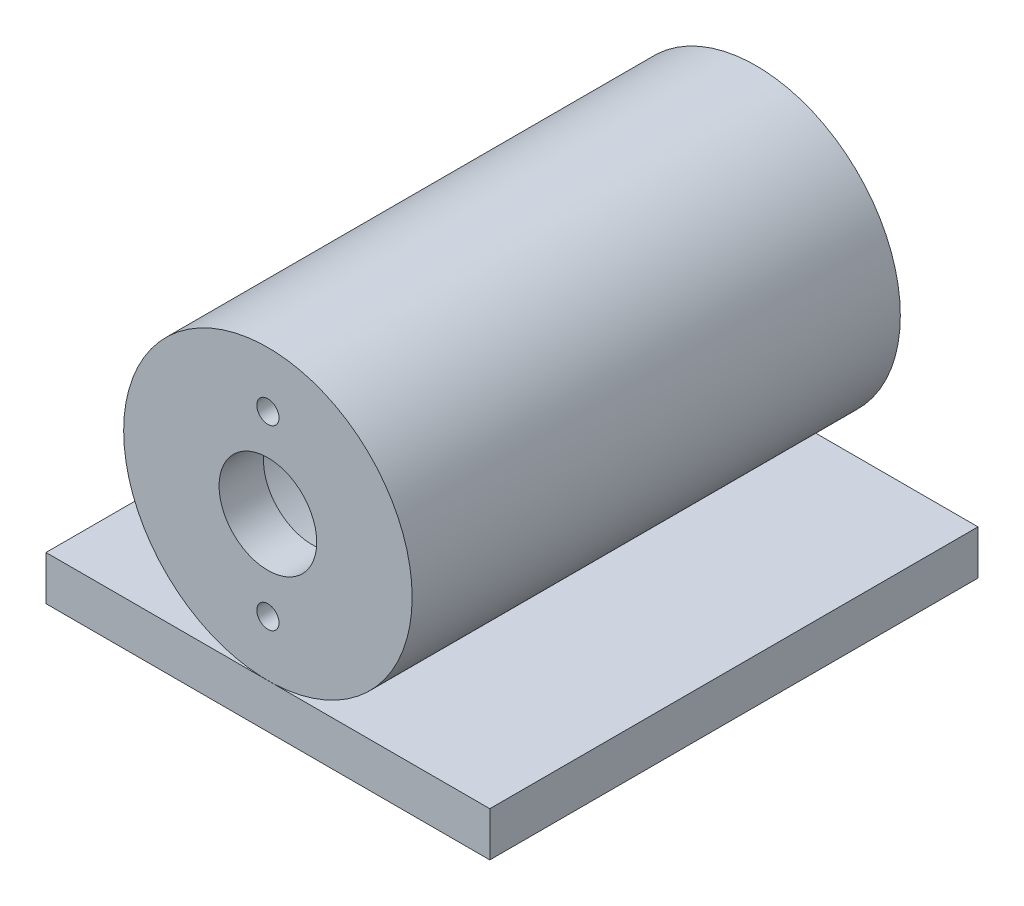
ISO-10303-21;
HEADER;
FILE_DESCRIPTION(('STEP AP214'),'2;1');
FILE_NAME('part.step','',(''),(''),'','','');
FILE_SCHEMA(('AUTOMOTIVE_DESIGN { 1 0 10303 214 1 1 1 1 }'));
ENDSEC;
DATA;
#1=APPLICATION_CONTEXT('core data for automotive mechanical design processes');
#2=APPLICATION_PROTOCOL_DEFINITION('international standard','automotive_design',2000,#1);
#3=PRODUCT_CONTEXT('',#1,'mechanical');
#4=PRODUCT('Part','Part','',(#3));
#5=PRODUCT_RELATED_PRODUCT_CATEGORY('part','',(#4));
#6=PRODUCT_DEFINITION_FORMATION('','',#4);
#7=PRODUCT_DEFINITION_CONTEXT('part definition',#1,'design');
#8=PRODUCT_DEFINITION('design','',#6,#7);
#9=PRODUCT_DEFINITION_SHAPE('','',#8);
#10=(LENGTH_UNIT() NAMED_UNIT(*) SI_UNIT(.MILLI.,.METRE.));
#11=(NAMED_UNIT(*) PLANE_ANGLE_UNIT() SI_UNIT($,.RADIAN.));
#12=(NAMED_UNIT(*) SI_UNIT($,.STERADIAN.) SOLID_ANGLE_UNIT());
#13=UNCERTAINTY_MEASURE_WITH_UNIT(LENGTH_MEASURE(1.E-05),#10,'distance_accuracy_value','');
#14=(GEOMETRIC_REPRESENTATION_CONTEXT(3) GLOBAL_UNCERTAINTY_ASSIGNED_CONTEXT((#13)) GLOBAL_UNIT_ASSIGNED_CONTEXT((#10,
#11,#12)) REPRESENTATION_CONTEXT('',''));
#15=CARTESIAN_POINT('',(0.,0.,0.));
#16=DIRECTION('',(0.,0.,1.));
#17=DIRECTION('',(1.,0.,0.));
#18=AXIS2_PLACEMENT_3D('',#15,#16,#17);
#19=CARTESIAN_POINT('',(0.,-26.9875,0.));
#20=DIRECTION('',(0.,1.,0.));
#21=DIRECTION('',(0.,0.,1.));
#22=AXIS2_PLACEMENT_3D('',#19,#20,#21);
#23=PLANE('',#22);
#24=DIRECTION('',(0.,0.,-1.));
#25=VECTOR('',#24,1.);
#26=CARTESIAN_POINT('',(-31.75,-26.9875,6.35));
#27=LINE('',#26,#25);
#28=CARTESIAN_POINT('',(-31.75,-26.9875,6.35));
#29=VERTEX_POINT('',#28);
#30=CARTESIAN_POINT('',(-31.75,-26.9875,-63.5));
#31=VERTEX_POINT('',#30);
#32=EDGE_CURVE('E55',#29,#31,#27,.T.);
#33=ORIENTED_EDGE('',*,*,#32,.T.);
#34=DIRECTION('',(1.,0.,0.));
#35=VECTOR('',#34,1.);
#36=CARTESIAN_POINT('',(-31.75,-26.9875,-63.5));
#37=LINE('',#36,#35);
#38=CARTESIAN_POINT('',(31.75,-26.9875,-63.5));
#39=VERTEX_POINT('',#38);
#40=EDGE_CURVE('E89',#31,#39,#37,.T.);
#41=ORIENTED_EDGE('',*,*,#40,.T.);
#42=DIRECTION('',(0.,0.,1.));
#43=VECTOR('',#42,1.);
#44=CARTESIAN_POINT('',(31.75,-26.9875,6.35));
#45=LINE('',#44,#43);
#46=CARTESIAN_POINT('',(31.75,-26.9875,6.35));
#47=VERTEX_POINT('',#46);
#48=EDGE_CURVE('E86',#39,#47,#45,.T.);
#49=ORIENTED_EDGE('',*,*,#48,.T.);
#50=DIRECTION('',(-1.,0.,0.));
#51=VECTOR('',#50,1.);
#52=CARTESIAN_POINT('',(-31.75,-26.9875,6.35));
#53=LINE('',#52,#51);
#54=EDGE_CURVE('E83',#47,#29,#53,.T.);
#55=ORIENTED_EDGE('',*,*,#54,.T.);
#56=EDGE_LOOP('',(#33,#41,#49,#55));
#57=FACE_BOUND('',#56,.T.);
#58=ADVANCED_FACE('F46',(#57),#23,.F.);
#59=CARTESIAN_POINT('',(0.,-20.6375,0.));
#60=DIRECTION('',(0.,1.,0.));
#61=DIRECTION('',(0.,0.,1.));
#62=AXIS2_PLACEMENT_3D('',#59,#60,#61);
#63=PLANE('',#62);
#64=DIRECTION('',(0.,0.,-1.));
#65=VECTOR('',#64,1.);
#66=CARTESIAN_POINT('',(-31.75,-20.6375,6.35));
#67=LINE('',#66,#65);
#68=CARTESIAN_POINT('',(-31.75,-20.6375,6.35));
#69=VERTEX_POINT('',#68);
#70=CARTESIAN_POINT('',(-31.75,-20.6375,-63.5));
#71=VERTEX_POINT('',#70);
#72=EDGE_CURVE('E13',#69,#71,#67,.T.);
#73=ORIENTED_EDGE('',*,*,#72,.F.);
#74=DIRECTION('',(-1.,0.,0.));
#75=VECTOR('',#74,1.);
#76=CARTESIAN_POINT('',(-31.75,-20.6375,6.35));
#77=LINE('',#76,#75);
#78=CARTESIAN_POINT('',(31.75,-20.6375,6.35));
#79=VERTEX_POINT('',#78);
#80=EDGE_CURVE('E103',#79,#69,#77,.T.);
#81=ORIENTED_EDGE('',*,*,#80,.F.);
#82=DIRECTION('',(0.,0.,1.));
#83=VECTOR('',#82,1.);
#84=CARTESIAN_POINT('',(31.75,-20.6375,6.35));
#85=LINE('',#84,#83);
#86=CARTESIAN_POINT('',(31.75,-20.6375,-63.5));
#87=VERTEX_POINT('',#86);
#88=EDGE_CURVE('E100',#87,#79,#85,.T.);
#89=ORIENTED_EDGE('',*,*,#88,.F.);
#90=DIRECTION('',(1.,0.,0.));
#91=VECTOR('',#90,1.);
#92=CARTESIAN_POINT('',(-31.75,-20.6375,-63.5));
#93=LINE('',#92,#91);
#94=EDGE_CURVE('E64',#71,#87,#93,.T.);
#95=ORIENTED_EDGE('',*,*,#94,.F.);
#96=EDGE_LOOP('',(#73,#81,#89,#95));
#97=FACE_BOUND('',#96,.T.);
#98=ADVANCED_FACE('F142',(#97),#63,.T.);
#99=CARTESIAN_POINT('',(-31.75,-20.6375,6.35));
#100=DIRECTION('',(0.,0.,1.));
#101=DIRECTION('',(1.,0.,0.));
#102=AXIS2_PLACEMENT_3D('',#99,#100,#101);
#103=PLANE('',#102);
#104=ORIENTED_EDGE('',*,*,#54,.F.);
#105=DIRECTION('',(0.,-1.,0.));
#106=VECTOR('',#105,1.);
#107=CARTESIAN_POINT('',(31.75,-20.6375,6.35));
#108=LINE('',#107,#106);
#109=EDGE_CURVE('E98',#79,#47,#108,.T.);
#110=ORIENTED_EDGE('',*,*,#109,.F.);
#111=ORIENTED_EDGE('',*,*,#80,.T.);
#112=DIRECTION('',(0.,-1.,0.));
#113=VECTOR('',#112,1.);
#114=CARTESIAN_POINT('',(-31.75,-20.6375,6.35));
#115=LINE('',#114,#113);
#116=EDGE_CURVE('E94',#69,#29,#115,.T.);
#117=ORIENTED_EDGE('',*,*,#116,.T.);
#118=EDGE_LOOP('',(#104,#110,#111,#117));
#119=FACE_BOUND('',#118,.T.);
#120=ADVANCED_FACE('F104',(#119),#103,.T.);
#121=CARTESIAN_POINT('',(31.75,-20.6375,6.35));
#122=DIRECTION('',(1.,0.,0.));
#123=DIRECTION('',(0.,0.,-1.));
#124=AXIS2_PLACEMENT_3D('',#121,#122,#123);
#125=PLANE('',#124);
#126=ORIENTED_EDGE('',*,*,#48,.F.);
#127=DIRECTION('',(0.,-1.,0.));
#128=VECTOR('',#127,1.);
#129=CARTESIAN_POINT('',(31.75,-20.6375,-63.5));
#130=LINE('',#129,#128);
#131=EDGE_CURVE('E93',#87,#39,#130,.T.);
#132=ORIENTED_EDGE('',*,*,#131,.F.);
#133=ORIENTED_EDGE('',*,*,#88,.T.);
#134=ORIENTED_EDGE('',*,*,#109,.T.);
#135=EDGE_LOOP('',(#126,#132,#133,#134));
#136=FACE_BOUND('',#135,.T.);
#137=ADVANCED_FACE('F99',(#136),#125,.T.);
#138=CARTESIAN_POINT('',(-31.75,-20.6375,-63.5));
#139=DIRECTION('',(0.,0.,-1.));
#140=DIRECTION('',(-1.,0.,0.));
#141=AXIS2_PLACEMENT_3D('',#138,#139,#140);
#142=PLANE('',#141);
#143=ORIENTED_EDGE('',*,*,#40,.F.);
#144=DIRECTION('',(0.,-1.,0.));
#145=VECTOR('',#144,1.);
#146=CARTESIAN_POINT('',(-31.75,-20.6375,-63.5));
#147=LINE('',#146,#145);
#148=EDGE_CURVE('E118',#71,#31,#147,.T.);
#149=ORIENTED_EDGE('',*,*,#148,.F.);
#150=ORIENTED_EDGE('',*,*,#94,.T.);
#151=ORIENTED_EDGE('',*,*,#131,.T.);
#152=EDGE_LOOP('',(#143,#149,#150,#151));
#153=FACE_BOUND('',#152,.T.);
#154=ADVANCED_FACE('F129',(#153),#142,.T.);
#155=CARTESIAN_POINT('',(-31.75,-20.6375,6.35));
#156=DIRECTION('',(-1.,0.,0.));
#157=DIRECTION('',(0.,0.,1.));
#158=AXIS2_PLACEMENT_3D('',#155,#156,#157);
#159=PLANE('',#158);
#160=ORIENTED_EDGE('',*,*,#32,.F.);
#161=ORIENTED_EDGE('',*,*,#116,.F.);
#162=ORIENTED_EDGE('',*,*,#72,.T.);
#163=ORIENTED_EDGE('',*,*,#148,.T.);
#164=EDGE_LOOP('',(#160,#161,#162,#163));
#165=FACE_BOUND('',#164,.T.);
#166=ADVANCED_FACE('F144',(#165),#159,.T.);
#167=CLOSED_SHELL('',(#58,#98,#120,#137,#154,#166));
#168=MANIFOLD_SOLID_BREP('B2',#167);
#169=CARTESIAN_POINT('',(0.,0.,0.));
#170=DIRECTION('',(0.,0.,1.));
#171=DIRECTION('',(1.,0.,0.));
#172=AXIS2_PLACEMENT_3D('',#169,#170,#171);
#173=PLANE('',#172);
#174=CARTESIAN_POINT('',(0.,0.,0.));
#175=DIRECTION('',(0.,0.,1.));
#176=DIRECTION('',(1.,0.,0.));
#177=AXIS2_PLACEMENT_3D('',#174,#175,#176);
#178=CIRCLE('',#177,6.985);
#179=CARTESIAN_POINT('',(6.985,0.,0.));
#180=VERTEX_POINT('',#179);
#181=EDGE_CURVE('E198',#180,#180,#178,.T.);
#182=ORIENTED_EDGE('',*,*,#181,.T.);
#183=EDGE_LOOP('',(#182));
#184=FACE_BOUND('',#183,.T.);
#185=CARTESIAN_POINT('',(0.,12.7,0.));
#186=DIRECTION('',(0.,0.,1.));
#187=DIRECTION('',(1.,0.,0.));
#188=AXIS2_PLACEMENT_3D('',#185,#186,#187);
#189=CIRCLE('',#188,1.5875);
#190=CARTESIAN_POINT('',(1.5875,12.7,0.));
#191=VERTEX_POINT('',#190);
#192=EDGE_CURVE('E213',#191,#191,#189,.T.);
#193=ORIENTED_EDGE('',*,*,#192,.T.);
#194=EDGE_LOOP('',(#193));
#195=FACE_BOUND('',#194,.T.);
#196=CARTESIAN_POINT('',(0.,-12.7,0.));
#197=DIRECTION('',(0.,0.,1.));
#198=DIRECTION('',(1.,0.,0.));
#199=AXIS2_PLACEMENT_3D('',#196,#197,#198);
#200=CIRCLE('',#199,1.5875);
#201=CARTESIAN_POINT('',(1.5875,-12.7,0.));
#202=VERTEX_POINT('',#201);
#203=EDGE_CURVE('E211',#202,#202,#200,.T.);
#204=ORIENTED_EDGE('',*,*,#203,.T.);
#205=EDGE_LOOP('',(#204));
#206=FACE_BOUND('',#205,.T.);
#207=CARTESIAN_POINT('',(0.,0.,0.));
#208=DIRECTION('',(0.,0.,-1.));
#209=DIRECTION('',(-1.,0.,0.));
#210=AXIS2_PLACEMENT_3D('',#207,#208,#209);
#211=CIRCLE('',#210,17.4625);
#212=CARTESIAN_POINT('',(-17.4625,0.,0.));
#213=VERTEX_POINT('',#212);
#214=EDGE_CURVE('E231',#213,#213,#211,.T.);
#215=ORIENTED_EDGE('',*,*,#214,.T.);
#216=EDGE_LOOP('',(#215));
#217=FACE_BOUND('',#216,.T.);
#218=ADVANCED_FACE('F194',(#184,#195,#206,#217),#173,.F.);
#219=CARTESIAN_POINT('',(0.,12.7,6.35));
#220=DIRECTION('',(0.,0.,-1.));
#221=DIRECTION('',(-1.,0.,0.));
#222=AXIS2_PLACEMENT_3D('',#219,#220,#221);
#223=CYLINDRICAL_SURFACE('',#222,1.5875);
#224=CARTESIAN_POINT('',(0.,12.7,6.35));
#225=DIRECTION('',(0.,0.,1.));
#226=DIRECTION('',(1.,0.,0.));
#227=AXIS2_PLACEMENT_3D('',#224,#225,#226);
#228=CIRCLE('',#227,1.5875);
#229=CARTESIAN_POINT('',(1.5875,12.7,6.35));
#230=VERTEX_POINT('',#229);
#231=EDGE_CURVE('E202',#230,#230,#228,.T.);
#232=ORIENTED_EDGE('',*,*,#231,.T.);
#233=EDGE_LOOP('',(#232));
#234=FACE_BOUND('',#233,.T.);
#235=ORIENTED_EDGE('',*,*,#192,.F.);
#236=EDGE_LOOP('',(#235));
#237=FACE_BOUND('',#236,.T.);
#238=ADVANCED_FACE('F253',(#234,#237),#223,.F.);
#239=CARTESIAN_POINT('',(0.,-12.7,6.35));
#240=DIRECTION('',(0.,0.,-1.));
#241=DIRECTION('',(-1.,0.,0.));
#242=AXIS2_PLACEMENT_3D('',#239,#240,#241);
#243=CYLINDRICAL_SURFACE('',#242,1.5875);
#244=CARTESIAN_POINT('',(0.,-12.7,6.35));
#245=DIRECTION('',(0.,0.,1.));
#246=DIRECTION('',(1.,0.,0.));
#247=AXIS2_PLACEMENT_3D('',#244,#245,#246);
#248=CIRCLE('',#247,1.5875);
#249=CARTESIAN_POINT('',(1.5875,-12.7,6.35));
#250=VERTEX_POINT('',#249);
#251=EDGE_CURVE('E207',#250,#250,#248,.T.);
#252=ORIENTED_EDGE('',*,*,#251,.T.);
#253=EDGE_LOOP('',(#252));
#254=FACE_BOUND('',#253,.T.);
#255=ORIENTED_EDGE('',*,*,#203,.F.);
#256=EDGE_LOOP('',(#255));
#257=FACE_BOUND('',#256,.T.);
#258=ADVANCED_FACE('F258',(#254,#257),#243,.F.);
#259=CARTESIAN_POINT('',(0.,0.,6.35));
#260=DIRECTION('',(0.,0.,-1.));
#261=DIRECTION('',(-1.,0.,0.));
#262=AXIS2_PLACEMENT_3D('',#259,#260,#261);
#263=CYLINDRICAL_SURFACE('',#262,20.6375);
#264=CARTESIAN_POINT('',(0.,0.,-63.5));
#265=DIRECTION('',(0.,0.,-1.));
#266=DIRECTION('',(-1.,0.,0.));
#267=AXIS2_PLACEMENT_3D('',#264,#265,#266);
#268=CIRCLE('',#267,20.6375);
#269=CARTESIAN_POINT('',(-20.6375,0.,-63.5));
#270=VERTEX_POINT('',#269);
#271=EDGE_CURVE('E214',#270,#270,#268,.T.);
#272=ORIENTED_EDGE('',*,*,#271,.F.);
#273=EDGE_LOOP('',(#272));
#274=FACE_BOUND('',#273,.T.);
#275=CARTESIAN_POINT('',(0.,0.,6.35));
#276=DIRECTION('',(0.,0.,1.));
#277=DIRECTION('',(1.,0.,0.));
#278=AXIS2_PLACEMENT_3D('',#275,#276,#277);
#279=CIRCLE('',#278,20.6375);
#280=CARTESIAN_POINT('',(20.6375,0.,6.35));
#281=VERTEX_POINT('',#280);
#282=EDGE_CURVE('E219',#281,#281,#279,.T.);
#283=ORIENTED_EDGE('',*,*,#282,.F.);
#284=EDGE_LOOP('',(#283));
#285=FACE_BOUND('',#284,.T.);
#286=ADVANCED_FACE('F196',(#274,#285),#263,.T.);
#287=CARTESIAN_POINT('',(0.,0.,6.35));
#288=DIRECTION('',(0.,0.,-1.));
#289=DIRECTION('',(-1.,0.,0.));
#290=AXIS2_PLACEMENT_3D('',#287,#288,#289);
#291=CYLINDRICAL_SURFACE('',#290,6.985);
#292=CARTESIAN_POINT('',(0.,0.,6.35));
#293=DIRECTION('',(0.,0.,1.));
#294=DIRECTION('',(1.,0.,0.));
#295=AXIS2_PLACEMENT_3D('',#292,#293,#294);
#296=CIRCLE('',#295,6.985);
#297=CARTESIAN_POINT('',(6.985,0.,6.35));
#298=VERTEX_POINT('',#297);
#299=EDGE_CURVE('E45',#298,#298,#296,.T.);
#300=ORIENTED_EDGE('',*,*,#299,.T.);
#301=EDGE_LOOP('',(#300));
#302=FACE_BOUND('',#301,.T.);
#303=ORIENTED_EDGE('',*,*,#181,.F.);
#304=EDGE_LOOP('',(#303));
#305=FACE_BOUND('',#304,.T.);
#306=ADVANCED_FACE('F250',(#302,#305),#291,.F.);
#307=CARTESIAN_POINT('',(0.,0.,6.35));
#308=DIRECTION('',(0.,0.,1.));
#309=DIRECTION('',(1.,0.,0.));
#310=AXIS2_PLACEMENT_3D('',#307,#308,#309);
#311=PLANE('',#310);
#312=ORIENTED_EDGE('',*,*,#282,.T.);
#313=EDGE_LOOP('',(#312));
#314=FACE_BOUND('',#313,.T.);
#315=ORIENTED_EDGE('',*,*,#251,.F.);
#316=EDGE_LOOP('',(#315));
#317=FACE_BOUND('',#316,.T.);
#318=ORIENTED_EDGE('',*,*,#231,.F.);
#319=EDGE_LOOP('',(#318));
#320=FACE_BOUND('',#319,.T.);
#321=ORIENTED_EDGE('',*,*,#299,.F.);
#322=EDGE_LOOP('',(#321));
#323=FACE_BOUND('',#322,.T.);
#324=ADVANCED_FACE('F242',(#314,#317,#320,#323),#311,.T.);
#325=CARTESIAN_POINT('',(0.,0.,-63.5));
#326=DIRECTION('',(0.,0.,-1.));
#327=DIRECTION('',(-1.,0.,0.));
#328=AXIS2_PLACEMENT_3D('',#325,#326,#327);
#329=PLANE('',#328);
#330=ORIENTED_EDGE('',*,*,#271,.T.);
#331=EDGE_LOOP('',(#330));
#332=FACE_BOUND('',#331,.T.);
#333=CARTESIAN_POINT('',(0.,0.,-63.5));
#334=DIRECTION('',(0.,0.,-1.));
#335=DIRECTION('',(-1.,0.,0.));
#336=AXIS2_PLACEMENT_3D('',#333,#334,#335);
#337=CIRCLE('',#336,17.4625);
#338=CARTESIAN_POINT('',(-17.4625,0.,-63.5));
#339=VERTEX_POINT('',#338);
#340=EDGE_CURVE('E230',#339,#339,#337,.T.);
#341=ORIENTED_EDGE('',*,*,#340,.F.);
#342=EDGE_LOOP('',(#341));
#343=FACE_BOUND('',#342,.T.);
#344=ADVANCED_FACE('F240',(#332,#343),#329,.T.);
#345=CARTESIAN_POINT('',(0.,0.,-63.5));
#346=DIRECTION('',(0.,0.,1.));
#347=DIRECTION('',(1.,0.,0.));
#348=AXIS2_PLACEMENT_3D('',#345,#346,#347);
#349=CYLINDRICAL_SURFACE('',#348,17.4625);
#350=ORIENTED_EDGE('',*,*,#340,.T.);
#351=EDGE_LOOP('',(#350));
#352=FACE_BOUND('',#351,.T.);
#353=ORIENTED_EDGE('',*,*,#214,.F.);
#354=EDGE_LOOP('',(#353));
#355=FACE_BOUND('',#354,.T.);
#356=ADVANCED_FACE('F237',(#352,#355),#349,.F.);
#357=CLOSED_SHELL('',(#218,#238,#258,#286,#306,#324,#344,#356));
#358=MANIFOLD_SOLID_BREP('B7',#357);
#359=ADVANCED_BREP_SHAPE_REPRESENTATION('',(#18,#168,#358),#14);
#360=SHAPE_DEFINITION_REPRESENTATION(#9,#359);
ENDSEC;
END-ISO-10303-21;
